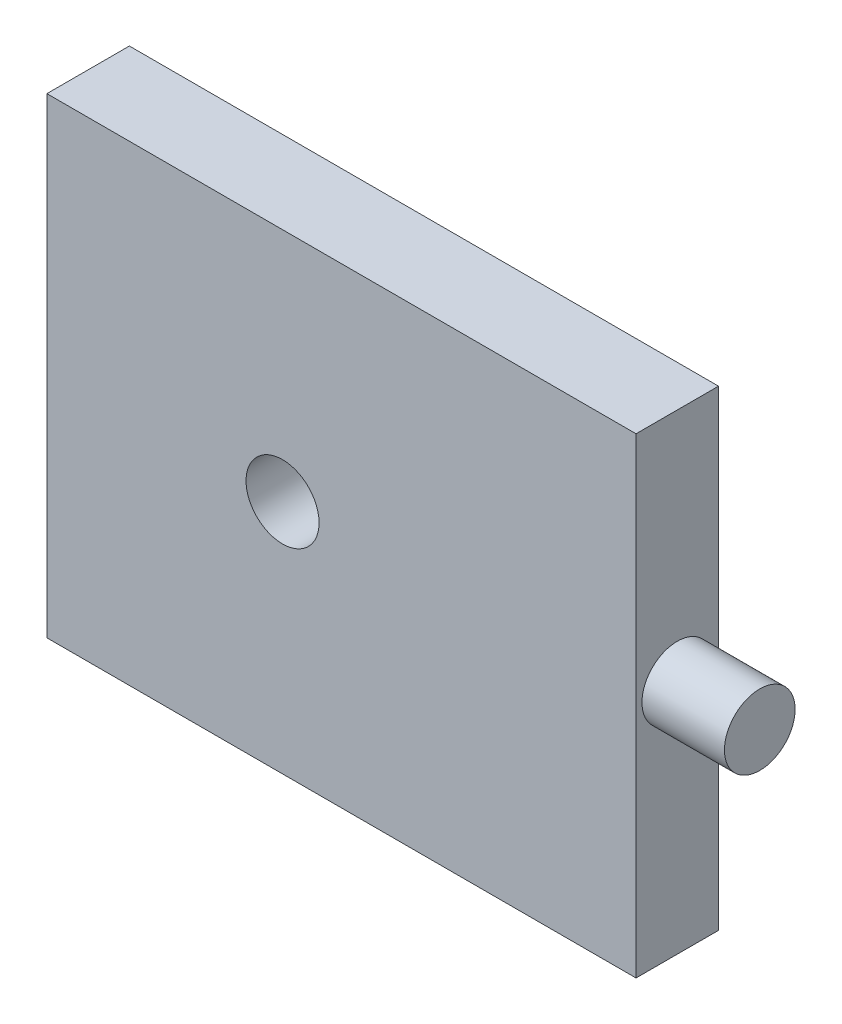
ISO-10303-21;
HEADER;
FILE_DESCRIPTION(('STEP AP214'),'2;1');
FILE_NAME('part.step','',(''),(''),'','','');
FILE_SCHEMA(('AUTOMOTIVE_DESIGN { 1 0 10303 214 1 1 1 1 }'));
ENDSEC;
DATA;
#1=APPLICATION_CONTEXT('core data for automotive mechanical design processes');
#2=APPLICATION_PROTOCOL_DEFINITION('international standard','automotive_design',2000,#1);
#3=PRODUCT_CONTEXT('',#1,'mechanical');
#4=PRODUCT('Part','Part','',(#3));
#5=PRODUCT_RELATED_PRODUCT_CATEGORY('part','',(#4));
#6=PRODUCT_DEFINITION_FORMATION('','',#4);
#7=PRODUCT_DEFINITION_CONTEXT('part definition',#1,'design');
#8=PRODUCT_DEFINITION('design','',#6,#7);
#9=PRODUCT_DEFINITION_SHAPE('','',#8);
#10=(LENGTH_UNIT() NAMED_UNIT(*) SI_UNIT(.MILLI.,.METRE.));
#11=(NAMED_UNIT(*) PLANE_ANGLE_UNIT() SI_UNIT($,.RADIAN.));
#12=(NAMED_UNIT(*) SI_UNIT($,.STERADIAN.) SOLID_ANGLE_UNIT());
#13=UNCERTAINTY_MEASURE_WITH_UNIT(LENGTH_MEASURE(1.E-05),#10,'distance_accuracy_value','');
#14=(GEOMETRIC_REPRESENTATION_CONTEXT(3) GLOBAL_UNCERTAINTY_ASSIGNED_CONTEXT((#13)) GLOBAL_UNIT_ASSIGNED_CONTEXT((#10,
#11,#12)) REPRESENTATION_CONTEXT('',''));
#15=CARTESIAN_POINT('',(0.,0.,0.));
#16=DIRECTION('',(0.,0.,1.));
#17=DIRECTION('',(1.,0.,0.));
#18=AXIS2_PLACEMENT_3D('',#15,#16,#17);
#19=CARTESIAN_POINT('',(0.,0.,3.5));
#20=DIRECTION('',(0.,0.,1.));
#21=DIRECTION('',(1.,0.,0.));
#22=AXIS2_PLACEMENT_3D('',#19,#20,#21);
#23=PLANE('',#22);
#24=DIRECTION('',(0.,-1.,0.));
#25=VECTOR('',#24,1.);
#26=CARTESIAN_POINT('',(-12.5,-10.,3.5));
#27=LINE('',#26,#25);
#28=CARTESIAN_POINT('',(-12.5,10.,3.5));
#29=VERTEX_POINT('',#28);
#30=CARTESIAN_POINT('',(-12.5,-10.,3.5));
#31=VERTEX_POINT('',#30);
#32=EDGE_CURVE('E98',#29,#31,#27,.T.);
#33=ORIENTED_EDGE('',*,*,#32,.T.);
#34=DIRECTION('',(1.,0.,0.));
#35=VECTOR('',#34,1.);
#36=CARTESIAN_POINT('',(12.5,-10.,3.5));
#37=LINE('',#36,#35);
#38=CARTESIAN_POINT('',(12.5,-10.,3.5));
#39=VERTEX_POINT('',#38);
#40=EDGE_CURVE('E93',#31,#39,#37,.T.);
#41=ORIENTED_EDGE('',*,*,#40,.T.);
#42=DIRECTION('',(0.,1.,0.));
#43=VECTOR('',#42,1.);
#44=CARTESIAN_POINT('',(12.5,-10.,3.5));
#45=LINE('',#44,#43);
#46=CARTESIAN_POINT('',(12.5,10.,3.5));
#47=VERTEX_POINT('',#46);
#48=EDGE_CURVE('E96',#39,#47,#45,.T.);
#49=ORIENTED_EDGE('',*,*,#48,.T.);
#50=DIRECTION('',(-1.,0.,0.));
#51=VECTOR('',#50,1.);
#52=CARTESIAN_POINT('',(12.5,10.,3.5));
#53=LINE('',#52,#51);
#54=EDGE_CURVE('E62',#47,#29,#53,.T.);
#55=ORIENTED_EDGE('',*,*,#54,.T.);
#56=EDGE_LOOP('',(#33,#41,#49,#55));
#57=FACE_BOUND('',#56,.T.);
#58=CARTESIAN_POINT('',(-2.5,0.,3.5));
#59=DIRECTION('',(0.,0.,1.));
#60=DIRECTION('',(1.,0.,0.));
#61=AXIS2_PLACEMENT_3D('',#58,#59,#60);
#62=CIRCLE('',#61,1.55);
#63=CARTESIAN_POINT('',(-0.949999999999997,0.,3.5));
#64=VERTEX_POINT('',#63);
#65=EDGE_CURVE('E119',#64,#64,#62,.T.);
#66=ORIENTED_EDGE('',*,*,#65,.F.);
#67=EDGE_LOOP('',(#66));
#68=FACE_BOUND('',#67,.T.);
#69=ADVANCED_FACE('F43',(#57,#68),#23,.T.);
#70=CARTESIAN_POINT('',(0.,0.,0.));
#71=DIRECTION('',(0.,0.,1.));
#72=DIRECTION('',(1.,0.,0.));
#73=AXIS2_PLACEMENT_3D('',#70,#71,#72);
#74=PLANE('',#73);
#75=DIRECTION('',(0.,-1.,0.));
#76=VECTOR('',#75,1.);
#77=CARTESIAN_POINT('',(-12.5,-10.,0.));
#78=LINE('',#77,#76);
#79=CARTESIAN_POINT('',(-12.5,10.,0.));
#80=VERTEX_POINT('',#79);
#81=CARTESIAN_POINT('',(-12.5,-10.,0.));
#82=VERTEX_POINT('',#81);
#83=EDGE_CURVE('E115',#80,#82,#78,.T.);
#84=ORIENTED_EDGE('',*,*,#83,.F.);
#85=DIRECTION('',(-1.,0.,0.));
#86=VECTOR('',#85,1.);
#87=CARTESIAN_POINT('',(12.5,10.,0.));
#88=LINE('',#87,#86);
#89=CARTESIAN_POINT('',(12.5,10.,0.));
#90=VERTEX_POINT('',#89);
#91=EDGE_CURVE('E85',#90,#80,#88,.T.);
#92=ORIENTED_EDGE('',*,*,#91,.F.);
#93=DIRECTION('',(0.,1.,0.));
#94=VECTOR('',#93,1.);
#95=CARTESIAN_POINT('',(12.5,-10.,0.));
#96=LINE('',#95,#94);
#97=CARTESIAN_POINT('',(12.5,-10.,0.));
#98=VERTEX_POINT('',#97);
#99=EDGE_CURVE('E79',#98,#90,#96,.T.);
#100=ORIENTED_EDGE('',*,*,#99,.F.);
#101=DIRECTION('',(1.,0.,0.));
#102=VECTOR('',#101,1.);
#103=CARTESIAN_POINT('',(12.5,-10.,0.));
#104=LINE('',#103,#102);
#105=EDGE_CURVE('E104',#82,#98,#104,.T.);
#106=ORIENTED_EDGE('',*,*,#105,.F.);
#107=EDGE_LOOP('',(#84,#92,#100,#106));
#108=FACE_BOUND('',#107,.T.);
#109=CARTESIAN_POINT('',(-2.5,0.,0.));
#110=DIRECTION('',(0.,0.,1.));
#111=DIRECTION('',(1.,0.,0.));
#112=AXIS2_PLACEMENT_3D('',#109,#110,#111);
#113=CIRCLE('',#112,1.55);
#114=CARTESIAN_POINT('',(-0.949999999999997,0.,0.));
#115=VERTEX_POINT('',#114);
#116=EDGE_CURVE('E137',#115,#115,#113,.T.);
#117=ORIENTED_EDGE('',*,*,#116,.T.);
#118=EDGE_LOOP('',(#117));
#119=FACE_BOUND('',#118,.T.);
#120=ADVANCED_FACE('F132',(#108,#119),#74,.F.);
#121=CARTESIAN_POINT('',(-12.5,-10.,3.5));
#122=DIRECTION('',(1.,0.,0.));
#123=DIRECTION('',(0.,0.,-1.));
#124=AXIS2_PLACEMENT_3D('',#121,#122,#123);
#125=PLANE('',#124);
#126=ORIENTED_EDGE('',*,*,#83,.T.);
#127=DIRECTION('',(0.,0.,-1.));
#128=VECTOR('',#127,1.);
#129=CARTESIAN_POINT('',(-12.5,-10.,3.5));
#130=LINE('',#129,#128);
#131=EDGE_CURVE('E47',#31,#82,#130,.T.);
#132=ORIENTED_EDGE('',*,*,#131,.F.);
#133=ORIENTED_EDGE('',*,*,#32,.F.);
#134=DIRECTION('',(0.,0.,-1.));
#135=VECTOR('',#134,1.);
#136=CARTESIAN_POINT('',(-12.5,10.,3.5));
#137=LINE('',#136,#135);
#138=EDGE_CURVE('E111',#29,#80,#137,.T.);
#139=ORIENTED_EDGE('',*,*,#138,.T.);
#140=EDGE_LOOP('',(#126,#132,#133,#139));
#141=FACE_BOUND('',#140,.T.);
#142=ADVANCED_FACE('F45',(#141),#125,.F.);
#143=CARTESIAN_POINT('',(12.5,-10.,3.5));
#144=DIRECTION('',(0.,1.,0.));
#145=DIRECTION('',(-1.,0.,0.));
#146=AXIS2_PLACEMENT_3D('',#143,#144,#145);
#147=PLANE('',#146);
#148=ORIENTED_EDGE('',*,*,#105,.T.);
#149=DIRECTION('',(0.,0.,-1.));
#150=VECTOR('',#149,1.);
#151=CARTESIAN_POINT('',(12.5,-10.,3.5));
#152=LINE('',#151,#150);
#153=EDGE_CURVE('E102',#39,#98,#152,.T.);
#154=ORIENTED_EDGE('',*,*,#153,.F.);
#155=ORIENTED_EDGE('',*,*,#40,.F.);
#156=ORIENTED_EDGE('',*,*,#131,.T.);
#157=EDGE_LOOP('',(#148,#154,#155,#156));
#158=FACE_BOUND('',#157,.T.);
#159=ADVANCED_FACE('F103',(#158),#147,.F.);
#160=CARTESIAN_POINT('',(12.5,-10.,3.5));
#161=DIRECTION('',(-1.,0.,0.));
#162=DIRECTION('',(0.,0.,1.));
#163=AXIS2_PLACEMENT_3D('',#160,#161,#162);
#164=PLANE('',#163);
#165=CARTESIAN_POINT('',(12.5,0.,1.75));
#166=DIRECTION('',(1.,0.,0.));
#167=DIRECTION('',(0.,0.,-1.));
#168=AXIS2_PLACEMENT_3D('',#165,#166,#167);
#169=CIRCLE('',#168,1.5);
#170=CARTESIAN_POINT('',(12.5,0.,0.25));
#171=VERTEX_POINT('',#170);
#172=EDGE_CURVE('E11',#171,#171,#169,.T.);
#173=ORIENTED_EDGE('',*,*,#172,.F.);
#174=EDGE_LOOP('',(#173));
#175=FACE_BOUND('',#174,.T.);
#176=ORIENTED_EDGE('',*,*,#99,.T.);
#177=DIRECTION('',(0.,0.,-1.));
#178=VECTOR('',#177,1.);
#179=CARTESIAN_POINT('',(12.5,10.,3.5));
#180=LINE('',#179,#178);
#181=EDGE_CURVE('E106',#47,#90,#180,.T.);
#182=ORIENTED_EDGE('',*,*,#181,.F.);
#183=ORIENTED_EDGE('',*,*,#48,.F.);
#184=ORIENTED_EDGE('',*,*,#153,.T.);
#185=EDGE_LOOP('',(#176,#182,#183,#184));
#186=FACE_BOUND('',#185,.T.);
#187=ADVANCED_FACE('F107',(#175,#186),#164,.F.);
#188=CARTESIAN_POINT('',(12.5,10.,3.5));
#189=DIRECTION('',(0.,-1.,0.));
#190=DIRECTION('',(1.,0.,0.));
#191=AXIS2_PLACEMENT_3D('',#188,#189,#190);
#192=PLANE('',#191);
#193=ORIENTED_EDGE('',*,*,#91,.T.);
#194=ORIENTED_EDGE('',*,*,#138,.F.);
#195=ORIENTED_EDGE('',*,*,#54,.F.);
#196=ORIENTED_EDGE('',*,*,#181,.T.);
#197=EDGE_LOOP('',(#193,#194,#195,#196));
#198=FACE_BOUND('',#197,.T.);
#199=ADVANCED_FACE('F129',(#198),#192,.F.);
#200=CARTESIAN_POINT('',(-2.5,0.,3.5));
#201=DIRECTION('',(0.,0.,-1.));
#202=DIRECTION('',(-1.,0.,0.));
#203=AXIS2_PLACEMENT_3D('',#200,#201,#202);
#204=CYLINDRICAL_SURFACE('',#203,1.55);
#205=ORIENTED_EDGE('',*,*,#65,.T.);
#206=EDGE_LOOP('',(#205));
#207=FACE_BOUND('',#206,.T.);
#208=ORIENTED_EDGE('',*,*,#116,.F.);
#209=EDGE_LOOP('',(#208));
#210=FACE_BOUND('',#209,.T.);
#211=ADVANCED_FACE('F154',(#207,#210),#204,.F.);
#212=CARTESIAN_POINT('',(16.,0.,1.75));
#213=DIRECTION('',(-1.,0.,0.));
#214=DIRECTION('',(0.,0.,1.));
#215=AXIS2_PLACEMENT_3D('',#212,#213,#214);
#216=CYLINDRICAL_SURFACE('',#215,1.5);
#217=CARTESIAN_POINT('',(16.,0.,1.75));
#218=DIRECTION('',(1.,0.,0.));
#219=DIRECTION('',(0.,0.,-1.));
#220=AXIS2_PLACEMENT_3D('',#217,#218,#219);
#221=CIRCLE('',#220,1.5);
#222=CARTESIAN_POINT('',(16.,0.,0.25));
#223=VERTEX_POINT('',#222);
#224=EDGE_CURVE('E141',#223,#223,#221,.T.);
#225=ORIENTED_EDGE('',*,*,#224,.F.);
#226=EDGE_LOOP('',(#225));
#227=FACE_BOUND('',#226,.T.);
#228=ORIENTED_EDGE('',*,*,#172,.T.);
#229=EDGE_LOOP('',(#228));
#230=FACE_BOUND('',#229,.T.);
#231=ADVANCED_FACE('F151',(#227,#230),#216,.T.);
#232=CARTESIAN_POINT('',(16.,0.,1.75));
#233=DIRECTION('',(1.,0.,0.));
#234=DIRECTION('',(0.,0.,-1.));
#235=AXIS2_PLACEMENT_3D('',#232,#233,#234);
#236=PLANE('',#235);
#237=ORIENTED_EDGE('',*,*,#224,.T.);
#238=EDGE_LOOP('',(#237));
#239=FACE_BOUND('',#238,.T.);
#240=ADVANCED_FACE('F149',(#239),#236,.T.);
#241=CLOSED_SHELL('',(#69,#120,#142,#159,#187,#199,#211,#231,#240));
#242=MANIFOLD_SOLID_BREP('B2',#241);
#243=ADVANCED_BREP_SHAPE_REPRESENTATION('',(#18,#242),#14);
#244=SHAPE_DEFINITION_REPRESENTATION(#9,#243);
ENDSEC;
END-ISO-10303-21;
